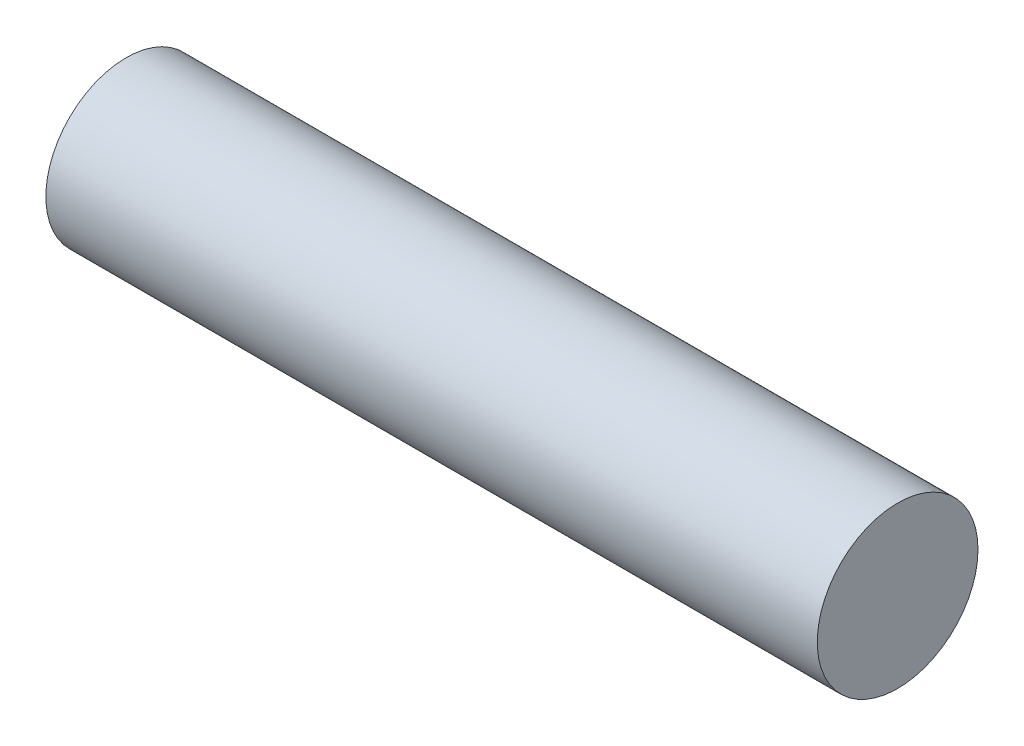
ISO-10303-21;
HEADER;
FILE_DESCRIPTION(('STEP AP214'),'2;1');
FILE_NAME('part.step','',(''),(''),'','','');
FILE_SCHEMA(('AUTOMOTIVE_DESIGN { 1 0 10303 214 1 1 1 1 }'));
ENDSEC;
DATA;
#1=APPLICATION_CONTEXT('core data for automotive mechanical design processes');
#2=APPLICATION_PROTOCOL_DEFINITION('international standard','automotive_design',2000,#1);
#3=PRODUCT_CONTEXT('',#1,'mechanical');
#4=PRODUCT('Part','Part','',(#3));
#5=PRODUCT_RELATED_PRODUCT_CATEGORY('part','',(#4));
#6=PRODUCT_DEFINITION_FORMATION('','',#4);
#7=PRODUCT_DEFINITION_CONTEXT('part definition',#1,'design');
#8=PRODUCT_DEFINITION('design','',#6,#7);
#9=PRODUCT_DEFINITION_SHAPE('','',#8);
#10=(LENGTH_UNIT() NAMED_UNIT(*) SI_UNIT(.MILLI.,.METRE.));
#11=(NAMED_UNIT(*) PLANE_ANGLE_UNIT() SI_UNIT($,.RADIAN.));
#12=(NAMED_UNIT(*) SI_UNIT($,.STERADIAN.) SOLID_ANGLE_UNIT());
#13=UNCERTAINTY_MEASURE_WITH_UNIT(LENGTH_MEASURE(1.E-05),#10,'distance_accuracy_value','');
#14=(GEOMETRIC_REPRESENTATION_CONTEXT(3) GLOBAL_UNCERTAINTY_ASSIGNED_CONTEXT((#13)) GLOBAL_UNIT_ASSIGNED_CONTEXT((#10,
#11,#12)) REPRESENTATION_CONTEXT('',''));
#15=CARTESIAN_POINT('',(0.,0.,0.));
#16=DIRECTION('',(0.,0.,1.));
#17=DIRECTION('',(1.,0.,0.));
#18=AXIS2_PLACEMENT_3D('',#15,#16,#17);
#19=CARTESIAN_POINT('',(12.,0.,0.));
#20=DIRECTION('',(-1.,0.,0.));
#21=DIRECTION('',(0.,0.,1.));
#22=AXIS2_PLACEMENT_3D('',#19,#20,#21);
#23=CYLINDRICAL_SURFACE('',#22,2.5);
#24=CARTESIAN_POINT('',(12.,0.,0.));
#25=DIRECTION('',(1.,0.,0.));
#26=DIRECTION('',(0.,0.,-1.));
#27=AXIS2_PLACEMENT_3D('',#24,#25,#26);
#28=CIRCLE('',#27,2.5);
#29=CARTESIAN_POINT('',(12.,0.,-2.5));
#30=VERTEX_POINT('',#29);
#31=EDGE_CURVE('E10',#30,#30,#28,.T.);
#32=ORIENTED_EDGE('',*,*,#31,.F.);
#33=EDGE_LOOP('',(#32));
#34=FACE_BOUND('',#33,.T.);
#35=CARTESIAN_POINT('',(-12.,0.,0.));
#36=DIRECTION('',(1.,0.,0.));
#37=DIRECTION('',(0.,0.,-1.));
#38=AXIS2_PLACEMENT_3D('',#35,#36,#37);
#39=CIRCLE('',#38,2.5);
#40=CARTESIAN_POINT('',(-12.,0.,-2.5));
#41=VERTEX_POINT('',#40);
#42=EDGE_CURVE('E34',#41,#41,#39,.T.);
#43=ORIENTED_EDGE('',*,*,#42,.T.);
#44=EDGE_LOOP('',(#43));
#45=FACE_BOUND('',#44,.T.);
#46=ADVANCED_FACE('F31',(#34,#45),#23,.T.);
#47=CARTESIAN_POINT('',(12.,0.,0.));
#48=DIRECTION('',(1.,0.,0.));
#49=DIRECTION('',(0.,0.,-1.));
#50=AXIS2_PLACEMENT_3D('',#47,#48,#49);
#51=PLANE('',#50);
#52=ORIENTED_EDGE('',*,*,#31,.T.);
#53=EDGE_LOOP('',(#52));
#54=FACE_BOUND('',#53,.T.);
#55=ADVANCED_FACE('F46',(#54),#51,.T.);
#56=CARTESIAN_POINT('',(-12.,0.,0.));
#57=DIRECTION('',(1.,0.,0.));
#58=DIRECTION('',(0.,0.,-1.));
#59=AXIS2_PLACEMENT_3D('',#56,#57,#58);
#60=PLANE('',#59);
#61=ORIENTED_EDGE('',*,*,#42,.F.);
#62=EDGE_LOOP('',(#61));
#63=FACE_BOUND('',#62,.T.);
#64=ADVANCED_FACE('F44',(#63),#60,.F.);
#65=CLOSED_SHELL('',(#46,#55,#64));
#66=MANIFOLD_SOLID_BREP('B2',#65);
#67=ADVANCED_BREP_SHAPE_REPRESENTATION('',(#18,#66),#14);
#68=SHAPE_DEFINITION_REPRESENTATION(#9,#67);
ENDSEC;
END-ISO-10303-21;
